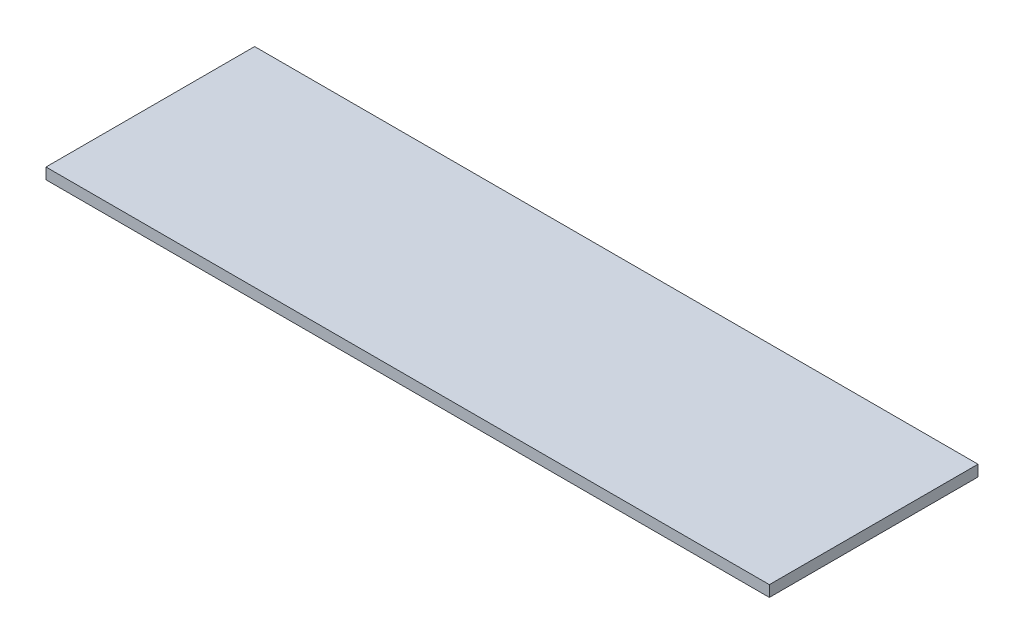
ISO-10303-21;
HEADER;
FILE_DESCRIPTION(('STEP AP214'),'2;1');
FILE_NAME('part.step','',(''),(''),'','','');
FILE_SCHEMA(('AUTOMOTIVE_DESIGN { 1 0 10303 214 1 1 1 1 }'));
ENDSEC;
DATA;
#1=APPLICATION_CONTEXT('core data for automotive mechanical design processes');
#2=APPLICATION_PROTOCOL_DEFINITION('international standard','automotive_design',2000,#1);
#3=PRODUCT_CONTEXT('',#1,'mechanical');
#4=PRODUCT('Part','Part','',(#3));
#5=PRODUCT_RELATED_PRODUCT_CATEGORY('part','',(#4));
#6=PRODUCT_DEFINITION_FORMATION('','',#4);
#7=PRODUCT_DEFINITION_CONTEXT('part definition',#1,'design');
#8=PRODUCT_DEFINITION('design','',#6,#7);
#9=PRODUCT_DEFINITION_SHAPE('','',#8);
#10=(LENGTH_UNIT() NAMED_UNIT(*) SI_UNIT(.MILLI.,.METRE.));
#11=(NAMED_UNIT(*) PLANE_ANGLE_UNIT() SI_UNIT($,.RADIAN.));
#12=(NAMED_UNIT(*) SI_UNIT($,.STERADIAN.) SOLID_ANGLE_UNIT());
#13=UNCERTAINTY_MEASURE_WITH_UNIT(LENGTH_MEASURE(1.E-05),#10,'distance_accuracy_value','');
#14=(GEOMETRIC_REPRESENTATION_CONTEXT(3) GLOBAL_UNCERTAINTY_ASSIGNED_CONTEXT((#13)) GLOBAL_UNIT_ASSIGNED_CONTEXT((#10,
#11,#12)) REPRESENTATION_CONTEXT('',''));
#15=CARTESIAN_POINT('',(0.,0.,0.));
#16=DIRECTION('',(0.,0.,1.));
#17=DIRECTION('',(1.,0.,0.));
#18=AXIS2_PLACEMENT_3D('',#15,#16,#17);
#19=CARTESIAN_POINT('',(-146.5,4.5,42.25));
#20=DIRECTION('',(1.,0.,0.));
#21=DIRECTION('',(0.,0.,-1.));
#22=AXIS2_PLACEMENT_3D('',#19,#20,#21);
#23=PLANE('',#22);
#24=DIRECTION('',(0.,0.,1.));
#25=VECTOR('',#24,1.);
#26=CARTESIAN_POINT('',(-146.5,0.,42.25));
#27=LINE('',#26,#25);
#28=CARTESIAN_POINT('',(-146.5,0.,-42.25));
#29=VERTEX_POINT('',#28);
#30=CARTESIAN_POINT('',(-146.5,0.,42.25));
#31=VERTEX_POINT('',#30);
#32=EDGE_CURVE('E97',#29,#31,#27,.T.);
#33=ORIENTED_EDGE('',*,*,#32,.T.);
#34=DIRECTION('',(0.,-1.,0.));
#35=VECTOR('',#34,1.);
#36=CARTESIAN_POINT('',(-146.5,4.5,42.25));
#37=LINE('',#36,#35);
#38=CARTESIAN_POINT('',(-146.5,4.5,42.25));
#39=VERTEX_POINT('',#38);
#40=EDGE_CURVE('E11',#39,#31,#37,.T.);
#41=ORIENTED_EDGE('',*,*,#40,.F.);
#42=DIRECTION('',(0.,0.,1.));
#43=VECTOR('',#42,1.);
#44=CARTESIAN_POINT('',(-146.5,4.5,42.25));
#45=LINE('',#44,#43);
#46=CARTESIAN_POINT('',(-146.5,4.5,-42.25));
#47=VERTEX_POINT('',#46);
#48=EDGE_CURVE('E85',#47,#39,#45,.T.);
#49=ORIENTED_EDGE('',*,*,#48,.F.);
#50=DIRECTION('',(0.,-1.,0.));
#51=VECTOR('',#50,1.);
#52=CARTESIAN_POINT('',(-146.5,4.5,-42.25));
#53=LINE('',#52,#51);
#54=EDGE_CURVE('E93',#47,#29,#53,.T.);
#55=ORIENTED_EDGE('',*,*,#54,.T.);
#56=EDGE_LOOP('',(#33,#41,#49,#55));
#57=FACE_BOUND('',#56,.T.);
#58=ADVANCED_FACE('F34',(#57),#23,.F.);
#59=CARTESIAN_POINT('',(146.5,4.5,42.25));
#60=DIRECTION('',(0.,0.,-1.));
#61=DIRECTION('',(-1.,0.,0.));
#62=AXIS2_PLACEMENT_3D('',#59,#60,#61);
#63=PLANE('',#62);
#64=DIRECTION('',(1.,0.,0.));
#65=VECTOR('',#64,1.);
#66=CARTESIAN_POINT('',(146.5,0.,42.25));
#67=LINE('',#66,#65);
#68=CARTESIAN_POINT('',(146.5,0.,42.25));
#69=VERTEX_POINT('',#68);
#70=EDGE_CURVE('E89',#31,#69,#67,.T.);
#71=ORIENTED_EDGE('',*,*,#70,.T.);
#72=DIRECTION('',(0.,-1.,0.));
#73=VECTOR('',#72,1.);
#74=CARTESIAN_POINT('',(146.5,4.5,42.25));
#75=LINE('',#74,#73);
#76=CARTESIAN_POINT('',(146.5,4.5,42.25));
#77=VERTEX_POINT('',#76);
#78=EDGE_CURVE('E42',#77,#69,#75,.T.);
#79=ORIENTED_EDGE('',*,*,#78,.F.);
#80=DIRECTION('',(1.,0.,0.));
#81=VECTOR('',#80,1.);
#82=CARTESIAN_POINT('',(146.5,4.5,42.25));
#83=LINE('',#82,#81);
#84=EDGE_CURVE('E80',#39,#77,#83,.T.);
#85=ORIENTED_EDGE('',*,*,#84,.F.);
#86=ORIENTED_EDGE('',*,*,#40,.T.);
#87=EDGE_LOOP('',(#71,#79,#85,#86));
#88=FACE_BOUND('',#87,.T.);
#89=ADVANCED_FACE('F88',(#88),#63,.F.);
#90=CARTESIAN_POINT('',(146.5,4.5,42.25));
#91=DIRECTION('',(-1.,0.,0.));
#92=DIRECTION('',(0.,0.,1.));
#93=AXIS2_PLACEMENT_3D('',#90,#91,#92);
#94=PLANE('',#93);
#95=DIRECTION('',(0.,0.,-1.));
#96=VECTOR('',#95,1.);
#97=CARTESIAN_POINT('',(146.5,0.,42.25));
#98=LINE('',#97,#96);
#99=CARTESIAN_POINT('',(146.5,0.,-42.25));
#100=VERTEX_POINT('',#99);
#101=EDGE_CURVE('E67',#69,#100,#98,.T.);
#102=ORIENTED_EDGE('',*,*,#101,.T.);
#103=DIRECTION('',(0.,-1.,0.));
#104=VECTOR('',#103,1.);
#105=CARTESIAN_POINT('',(146.5,4.5,-42.25));
#106=LINE('',#105,#104);
#107=CARTESIAN_POINT('',(146.5,4.5,-42.25));
#108=VERTEX_POINT('',#107);
#109=EDGE_CURVE('E90',#108,#100,#106,.T.);
#110=ORIENTED_EDGE('',*,*,#109,.F.);
#111=DIRECTION('',(0.,0.,-1.));
#112=VECTOR('',#111,1.);
#113=CARTESIAN_POINT('',(146.5,4.5,42.25));
#114=LINE('',#113,#112);
#115=EDGE_CURVE('E83',#77,#108,#114,.T.);
#116=ORIENTED_EDGE('',*,*,#115,.F.);
#117=ORIENTED_EDGE('',*,*,#78,.T.);
#118=EDGE_LOOP('',(#102,#110,#116,#117));
#119=FACE_BOUND('',#118,.T.);
#120=ADVANCED_FACE('F91',(#119),#94,.F.);
#121=CARTESIAN_POINT('',(146.5,4.5,-42.25));
#122=DIRECTION('',(0.,0.,1.));
#123=DIRECTION('',(1.,0.,0.));
#124=AXIS2_PLACEMENT_3D('',#121,#122,#123);
#125=PLANE('',#124);
#126=DIRECTION('',(-1.,0.,0.));
#127=VECTOR('',#126,1.);
#128=CARTESIAN_POINT('',(146.5,0.,-42.25));
#129=LINE('',#128,#127);
#130=EDGE_CURVE('E73',#100,#29,#129,.T.);
#131=ORIENTED_EDGE('',*,*,#130,.T.);
#132=ORIENTED_EDGE('',*,*,#54,.F.);
#133=DIRECTION('',(-1.,0.,0.));
#134=VECTOR('',#133,1.);
#135=CARTESIAN_POINT('',(146.5,4.5,-42.25));
#136=LINE('',#135,#134);
#137=EDGE_CURVE('E50',#108,#47,#136,.T.);
#138=ORIENTED_EDGE('',*,*,#137,.F.);
#139=ORIENTED_EDGE('',*,*,#109,.T.);
#140=EDGE_LOOP('',(#131,#132,#138,#139));
#141=FACE_BOUND('',#140,.T.);
#142=ADVANCED_FACE('F104',(#141),#125,.F.);
#143=CARTESIAN_POINT('',(0.,4.5,0.));
#144=DIRECTION('',(0.,1.,0.));
#145=DIRECTION('',(0.,0.,1.));
#146=AXIS2_PLACEMENT_3D('',#143,#144,#145);
#147=PLANE('',#146);
#148=ORIENTED_EDGE('',*,*,#48,.T.);
#149=ORIENTED_EDGE('',*,*,#84,.T.);
#150=ORIENTED_EDGE('',*,*,#115,.T.);
#151=ORIENTED_EDGE('',*,*,#137,.T.);
#152=EDGE_LOOP('',(#148,#149,#150,#151));
#153=FACE_BOUND('',#152,.T.);
#154=ADVANCED_FACE('F81',(#153),#147,.T.);
#155=CARTESIAN_POINT('',(0.,0.,0.));
#156=DIRECTION('',(0.,1.,0.));
#157=DIRECTION('',(0.,0.,1.));
#158=AXIS2_PLACEMENT_3D('',#155,#156,#157);
#159=PLANE('',#158);
#160=ORIENTED_EDGE('',*,*,#32,.F.);
#161=ORIENTED_EDGE('',*,*,#130,.F.);
#162=ORIENTED_EDGE('',*,*,#101,.F.);
#163=ORIENTED_EDGE('',*,*,#70,.F.);
#164=EDGE_LOOP('',(#160,#161,#162,#163));
#165=FACE_BOUND('',#164,.T.);
#166=ADVANCED_FACE('F107',(#165),#159,.F.);
#167=CLOSED_SHELL('',(#58,#89,#120,#142,#154,#166));
#168=MANIFOLD_SOLID_BREP('B2',#167);
#169=ADVANCED_BREP_SHAPE_REPRESENTATION('',(#18,#168),#14);
#170=SHAPE_DEFINITION_REPRESENTATION(#9,#169);
ENDSEC;
END-ISO-10303-21;
